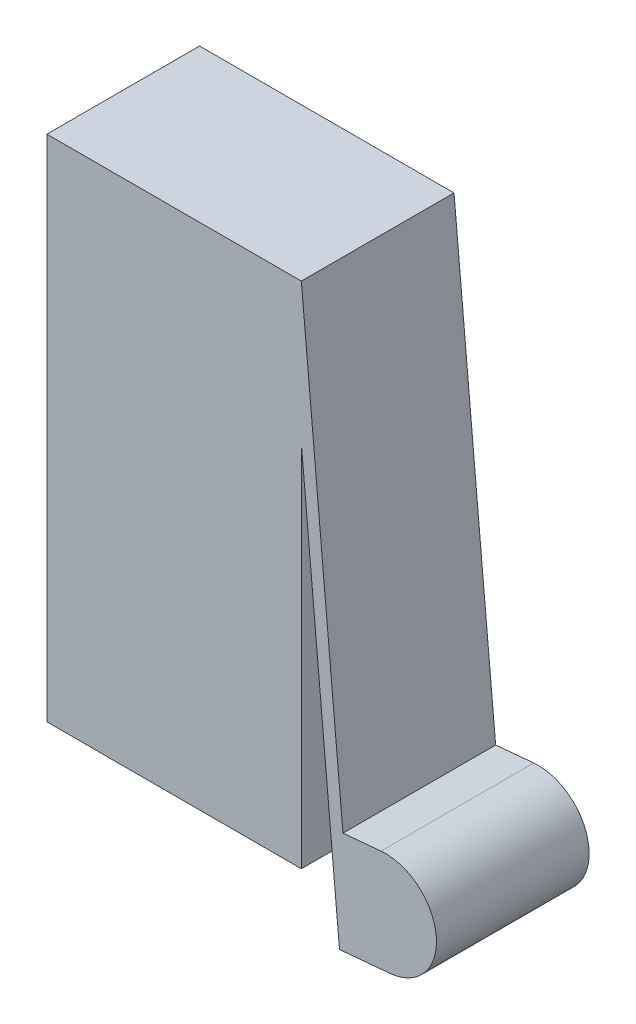
ISO-10303-21;
HEADER;
FILE_DESCRIPTION(('STEP AP214'),'2;1');
FILE_NAME('part.step','',(''),(''),'','','');
FILE_SCHEMA(('AUTOMOTIVE_DESIGN { 1 0 10303 214 1 1 1 1 }'));
ENDSEC;
DATA;
#1=APPLICATION_CONTEXT('core data for automotive mechanical design processes');
#2=APPLICATION_PROTOCOL_DEFINITION('international standard','automotive_design',2000,#1);
#3=PRODUCT_CONTEXT('',#1,'mechanical');
#4=PRODUCT('Part','Part','',(#3));
#5=PRODUCT_RELATED_PRODUCT_CATEGORY('part','',(#4));
#6=PRODUCT_DEFINITION_FORMATION('','',#4);
#7=PRODUCT_DEFINITION_CONTEXT('part definition',#1,'design');
#8=PRODUCT_DEFINITION('design','',#6,#7);
#9=PRODUCT_DEFINITION_SHAPE('','',#8);
#10=(LENGTH_UNIT() NAMED_UNIT(*) SI_UNIT(.MILLI.,.METRE.));
#11=(NAMED_UNIT(*) PLANE_ANGLE_UNIT() SI_UNIT($,.RADIAN.));
#12=(NAMED_UNIT(*) SI_UNIT($,.STERADIAN.) SOLID_ANGLE_UNIT());
#13=UNCERTAINTY_MEASURE_WITH_UNIT(LENGTH_MEASURE(1.E-05),#10,'distance_accuracy_value','');
#14=(GEOMETRIC_REPRESENTATION_CONTEXT(3) GLOBAL_UNCERTAINTY_ASSIGNED_CONTEXT((#13)) GLOBAL_UNIT_ASSIGNED_CONTEXT((#10,
#11,#12)) REPRESENTATION_CONTEXT('',''));
#15=CARTESIAN_POINT('',(0.,0.,0.));
#16=DIRECTION('',(0.,0.,1.));
#17=DIRECTION('',(1.,0.,0.));
#18=AXIS2_PLACEMENT_3D('',#15,#16,#17);
#19=CARTESIAN_POINT('',(10.,0.,6.));
#20=DIRECTION('',(1.,0.,0.));
#21=DIRECTION('',(0.,1.,0.));
#22=AXIS2_PLACEMENT_3D('',#19,#20,#21);
#23=PLANE('',#22);
#24=DIRECTION('',(0.,-1.,0.));
#25=VECTOR('',#24,1.);
#26=CARTESIAN_POINT('',(10.,0.,0.));
#27=LINE('',#26,#25);
#28=CARTESIAN_POINT('',(10.,14.4829721181068,0.));
#29=VERTEX_POINT('',#28);
#30=CARTESIAN_POINT('',(10.,0.,0.));
#31=VERTEX_POINT('',#30);
#32=EDGE_CURVE('E134',#29,#31,#27,.T.);
#33=ORIENTED_EDGE('',*,*,#32,.F.);
#34=DIRECTION('',(0.,0.,-1.));
#35=VECTOR('',#34,1.);
#36=CARTESIAN_POINT('',(10.,14.4829721181068,6.));
#37=LINE('',#36,#35);
#38=CARTESIAN_POINT('',(10.,14.4829721181068,6.));
#39=VERTEX_POINT('',#38);
#40=EDGE_CURVE('E11',#39,#29,#37,.T.);
#41=ORIENTED_EDGE('',*,*,#40,.F.);
#42=DIRECTION('',(0.,-1.,0.));
#43=VECTOR('',#42,1.);
#44=CARTESIAN_POINT('',(10.,0.,6.));
#45=LINE('',#44,#43);
#46=CARTESIAN_POINT('',(10.,0.,6.));
#47=VERTEX_POINT('',#46);
#48=EDGE_CURVE('E155',#39,#47,#45,.T.);
#49=ORIENTED_EDGE('',*,*,#48,.T.);
#50=DIRECTION('',(0.,0.,-1.));
#51=VECTOR('',#50,1.);
#52=CARTESIAN_POINT('',(10.,0.,6.));
#53=LINE('',#52,#51);
#54=EDGE_CURVE('E86',#47,#31,#53,.T.);
#55=ORIENTED_EDGE('',*,*,#54,.T.);
#56=EDGE_LOOP('',(#33,#41,#49,#55));
#57=FACE_BOUND('',#56,.T.);
#58=ADVANCED_FACE('F33',(#57),#23,.T.);
#59=CARTESIAN_POINT('',(11.2250333482068,1.02151176994432,6.));
#60=DIRECTION('',(0.995884769297829,0.0906285069975793,0.));
#61=DIRECTION('',(-0.0906285069975793,0.995884769297829,0.));
#62=AXIS2_PLACEMENT_3D('',#59,#60,#61);
#63=PLANE('',#62);
#64=DIRECTION('',(0.0906285069975793,-0.995884769297829,0.));
#65=VECTOR('',#64,1.);
#66=CARTESIAN_POINT('',(11.2250333482068,1.02151176994432,0.));
#67=LINE('',#66,#65);
#68=CARTESIAN_POINT('',(11.5,-2.,0.));
#69=VERTEX_POINT('',#68);
#70=EDGE_CURVE('E137',#29,#69,#67,.T.);
#71=ORIENTED_EDGE('',*,*,#70,.T.);
#72=DIRECTION('',(0.,0.,-1.));
#73=VECTOR('',#72,1.);
#74=CARTESIAN_POINT('',(11.5,-2.,6.));
#75=LINE('',#74,#73);
#76=CARTESIAN_POINT('',(11.5,-2.,6.));
#77=VERTEX_POINT('',#76);
#78=EDGE_CURVE('E41',#77,#69,#75,.T.);
#79=ORIENTED_EDGE('',*,*,#78,.F.);
#80=DIRECTION('',(0.0906285069975793,-0.995884769297829,0.));
#81=VECTOR('',#80,1.);
#82=CARTESIAN_POINT('',(11.2250333482068,1.02151176994432,6.));
#83=LINE('',#82,#81);
#84=EDGE_CURVE('E185',#39,#77,#83,.T.);
#85=ORIENTED_EDGE('',*,*,#84,.F.);
#86=ORIENTED_EDGE('',*,*,#40,.T.);
#87=EDGE_LOOP('',(#71,#79,#85,#86));
#88=FACE_BOUND('',#87,.T.);
#89=ADVANCED_FACE('F189',(#88),#63,.F.);
#90=CARTESIAN_POINT('',(0.274966651793202,-3.02151176994433,6.));
#91=DIRECTION('',(-0.0906285069975797,0.995884769297829,0.));
#92=DIRECTION('',(-0.995884769297829,-0.0906285069975797,0.));
#93=AXIS2_PLACEMENT_3D('',#90,#91,#92);
#94=PLANE('',#93);
#95=DIRECTION('',(0.995884769297829,0.0906285069975797,0.));
#96=VECTOR('',#95,1.);
#97=CARTESIAN_POINT('',(0.274966651793202,-3.02151176994433,0.));
#98=LINE('',#97,#96);
#99=CARTESIAN_POINT('',(13.4917695385957,-1.81874298600484,0.));
#100=VERTEX_POINT('',#99);
#101=EDGE_CURVE('E139',#69,#100,#98,.T.);
#102=ORIENTED_EDGE('',*,*,#101,.T.);
#103=DIRECTION('',(0.,0.,-1.));
#104=VECTOR('',#103,1.);
#105=CARTESIAN_POINT('',(13.4917695385957,-1.81874298600484,6.));
#106=LINE('',#105,#104);
#107=CARTESIAN_POINT('',(13.4917695385957,-1.81874298600484,6.));
#108=VERTEX_POINT('',#107);
#109=EDGE_CURVE('E163',#108,#100,#106,.T.);
#110=ORIENTED_EDGE('',*,*,#109,.F.);
#111=DIRECTION('',(0.995884769297829,0.0906285069975797,0.));
#112=VECTOR('',#111,1.);
#113=CARTESIAN_POINT('',(0.274966651793202,-3.02151176994433,6.));
#114=LINE('',#113,#112);
#115=EDGE_CURVE('E171',#77,#108,#114,.T.);
#116=ORIENTED_EDGE('',*,*,#115,.F.);
#117=ORIENTED_EDGE('',*,*,#78,.T.);
#118=EDGE_LOOP('',(#102,#110,#116,#117));
#119=FACE_BOUND('',#118,.T.);
#120=ADVANCED_FACE('F169',(#119),#94,.F.);
#121=CARTESIAN_POINT('',(13.3105125246005,0.173026552590817,6.));
#122=DIRECTION('',(0.,0.,-1.));
#123=DIRECTION('',(-1.,0.,0.));
#124=AXIS2_PLACEMENT_3D('',#121,#122,#123);
#125=CYLINDRICAL_SURFACE('',#124,2.);
#126=CARTESIAN_POINT('',(13.3105125246005,0.173026552590817,0.));
#127=DIRECTION('',(0.,0.,1.));
#128=DIRECTION('',(1.,0.,0.));
#129=AXIS2_PLACEMENT_3D('',#126,#127,#128);
#130=CIRCLE('',#129,2.);
#131=CARTESIAN_POINT('',(13.1292555106053,2.16479609118647,0.));
#132=VERTEX_POINT('',#131);
#133=EDGE_CURVE('E142',#132,#100,#130,.F.);
#134=ORIENTED_EDGE('',*,*,#133,.F.);
#135=DIRECTION('',(0.,0.,-1.));
#136=VECTOR('',#135,1.);
#137=CARTESIAN_POINT('',(13.1292555106053,2.16479609118647,6.));
#138=LINE('',#137,#136);
#139=CARTESIAN_POINT('',(13.1292555106053,2.16479609118647,6.));
#140=VERTEX_POINT('',#139);
#141=EDGE_CURVE('E161',#140,#132,#138,.T.);
#142=ORIENTED_EDGE('',*,*,#141,.F.);
#143=CARTESIAN_POINT('',(13.3105125246005,0.173026552590817,6.));
#144=DIRECTION('',(0.,0.,1.));
#145=DIRECTION('',(1.,0.,0.));
#146=AXIS2_PLACEMENT_3D('',#143,#144,#145);
#147=CIRCLE('',#146,2.);
#148=EDGE_CURVE('E182',#140,#108,#147,.F.);
#149=ORIENTED_EDGE('',*,*,#148,.T.);
#150=ORIENTED_EDGE('',*,*,#109,.T.);
#151=EDGE_LOOP('',(#134,#142,#149,#150));
#152=FACE_BOUND('',#151,.T.);
#153=ADVANCED_FACE('F179',(#152),#125,.T.);
#154=CARTESIAN_POINT('',(-0.0875473761971172,0.96202730724699,6.));
#155=DIRECTION('',(-0.0906285069975793,0.995884769297829,0.));
#156=DIRECTION('',(-0.995884769297829,-0.0906285069975793,0.));
#157=AXIS2_PLACEMENT_3D('',#154,#155,#156);
#158=PLANE('',#157);
#159=DIRECTION('',(0.995884769297829,0.0906285069975793,0.));
#160=VECTOR('',#159,1.);
#161=CARTESIAN_POINT('',(-0.0875473761971172,0.96202730724699,0.));
#162=LINE('',#161,#160);
#163=CARTESIAN_POINT('',(11.6354283566586,2.02885333069011,0.));
#164=VERTEX_POINT('',#163);
#165=EDGE_CURVE('E145',#164,#132,#162,.T.);
#166=ORIENTED_EDGE('',*,*,#165,.F.);
#167=DIRECTION('',(0.,0.,-1.));
#168=VECTOR('',#167,1.);
#169=CARTESIAN_POINT('',(11.6354283566586,2.02885333069011,6.));
#170=LINE('',#169,#168);
#171=CARTESIAN_POINT('',(11.6354283566586,2.02885333069011,6.));
#172=VERTEX_POINT('',#171);
#173=EDGE_CURVE('E159',#172,#164,#170,.T.);
#174=ORIENTED_EDGE('',*,*,#173,.F.);
#175=DIRECTION('',(0.995884769297829,0.0906285069975793,0.));
#176=VECTOR('',#175,1.);
#177=CARTESIAN_POINT('',(-0.0875473761971172,0.96202730724699,6.));
#178=LINE('',#177,#176);
#179=EDGE_CURVE('E129',#172,#140,#178,.T.);
#180=ORIENTED_EDGE('',*,*,#179,.T.);
#181=ORIENTED_EDGE('',*,*,#141,.T.);
#182=EDGE_LOOP('',(#166,#174,#180,#181));
#183=FACE_BOUND('',#182,.T.);
#184=ADVANCED_FACE('F199',(#183),#158,.T.);
#185=CARTESIAN_POINT('',(11.7229757328557,1.06682602344312,6.));
#186=DIRECTION('',(0.995884769297829,0.0906285069975793,0.));
#187=DIRECTION('',(-0.0906285069975793,0.995884769297829,0.));
#188=AXIS2_PLACEMENT_3D('',#185,#186,#187);
#189=PLANE('',#188);
#190=DIRECTION('',(0.0906285069975793,-0.995884769297829,0.));
#191=VECTOR('',#190,1.);
#192=CARTESIAN_POINT('',(11.7229757328557,1.06682602344312,0.));
#193=LINE('',#192,#191);
#194=CARTESIAN_POINT('',(10.,20.,0.));
#195=VERTEX_POINT('',#194);
#196=EDGE_CURVE('E148',#195,#164,#193,.T.);
#197=ORIENTED_EDGE('',*,*,#196,.F.);
#198=DIRECTION('',(0.,0.,-1.));
#199=VECTOR('',#198,1.);
#200=CARTESIAN_POINT('',(10.,20.,6.));
#201=LINE('',#200,#199);
#202=CARTESIAN_POINT('',(10.,20.,6.));
#203=VERTEX_POINT('',#202);
#204=EDGE_CURVE('E117',#203,#195,#201,.T.);
#205=ORIENTED_EDGE('',*,*,#204,.F.);
#206=DIRECTION('',(0.0906285069975793,-0.995884769297829,0.));
#207=VECTOR('',#206,1.);
#208=CARTESIAN_POINT('',(11.7229757328557,1.06682602344312,6.));
#209=LINE('',#208,#207);
#210=EDGE_CURVE('E127',#203,#172,#209,.T.);
#211=ORIENTED_EDGE('',*,*,#210,.T.);
#212=ORIENTED_EDGE('',*,*,#173,.T.);
#213=EDGE_LOOP('',(#197,#205,#211,#212));
#214=FACE_BOUND('',#213,.T.);
#215=ADVANCED_FACE('F202',(#214),#189,.T.);
#216=CARTESIAN_POINT('',(0.,20.,6.));
#217=DIRECTION('',(0.,1.,0.));
#218=DIRECTION('',(0.,0.,1.));
#219=AXIS2_PLACEMENT_3D('',#216,#217,#218);
#220=PLANE('',#219);
#221=DIRECTION('',(1.,0.,0.));
#222=VECTOR('',#221,1.);
#223=CARTESIAN_POINT('',(0.,20.,0.));
#224=LINE('',#223,#222);
#225=CARTESIAN_POINT('',(0.,20.,0.));
#226=VERTEX_POINT('',#225);
#227=EDGE_CURVE('E116',#226,#195,#224,.T.);
#228=ORIENTED_EDGE('',*,*,#227,.F.);
#229=DIRECTION('',(0.,0.,-1.));
#230=VECTOR('',#229,1.);
#231=CARTESIAN_POINT('',(0.,20.,6.));
#232=LINE('',#231,#230);
#233=CARTESIAN_POINT('',(0.,20.,6.));
#234=VERTEX_POINT('',#233);
#235=EDGE_CURVE('E110',#234,#226,#232,.T.);
#236=ORIENTED_EDGE('',*,*,#235,.F.);
#237=DIRECTION('',(1.,0.,0.));
#238=VECTOR('',#237,1.);
#239=CARTESIAN_POINT('',(0.,20.,6.));
#240=LINE('',#239,#238);
#241=EDGE_CURVE('E114',#234,#203,#240,.T.);
#242=ORIENTED_EDGE('',*,*,#241,.T.);
#243=ORIENTED_EDGE('',*,*,#204,.T.);
#244=EDGE_LOOP('',(#228,#236,#242,#243));
#245=FACE_BOUND('',#244,.T.);
#246=ADVANCED_FACE('F112',(#245),#220,.T.);
#247=CARTESIAN_POINT('',(0.,0.,6.));
#248=DIRECTION('',(1.,0.,0.));
#249=DIRECTION('',(0.,1.,0.));
#250=AXIS2_PLACEMENT_3D('',#247,#248,#249);
#251=PLANE('',#250);
#252=DIRECTION('',(0.,-1.,0.));
#253=VECTOR('',#252,1.);
#254=CARTESIAN_POINT('',(0.,0.,0.));
#255=LINE('',#254,#253);
#256=CARTESIAN_POINT('',(0.,0.,0.));
#257=VERTEX_POINT('',#256);
#258=EDGE_CURVE('E79',#226,#257,#255,.T.);
#259=ORIENTED_EDGE('',*,*,#258,.T.);
#260=DIRECTION('',(0.,0.,-1.));
#261=VECTOR('',#260,1.);
#262=CARTESIAN_POINT('',(0.,0.,6.));
#263=LINE('',#262,#261);
#264=CARTESIAN_POINT('',(0.,0.,6.));
#265=VERTEX_POINT('',#264);
#266=EDGE_CURVE('E118',#265,#257,#263,.T.);
#267=ORIENTED_EDGE('',*,*,#266,.F.);
#268=DIRECTION('',(0.,-1.,0.));
#269=VECTOR('',#268,1.);
#270=CARTESIAN_POINT('',(0.,0.,6.));
#271=LINE('',#270,#269);
#272=EDGE_CURVE('E120',#234,#265,#271,.T.);
#273=ORIENTED_EDGE('',*,*,#272,.F.);
#274=ORIENTED_EDGE('',*,*,#235,.T.);
#275=EDGE_LOOP('',(#259,#267,#273,#274));
#276=FACE_BOUND('',#275,.T.);
#277=ADVANCED_FACE('F121',(#276),#251,.F.);
#278=CARTESIAN_POINT('',(0.,0.,6.));
#279=DIRECTION('',(0.,1.,0.));
#280=DIRECTION('',(0.,0.,1.));
#281=AXIS2_PLACEMENT_3D('',#278,#279,#280);
#282=PLANE('',#281);
#283=DIRECTION('',(1.,0.,0.));
#284=VECTOR('',#283,1.);
#285=CARTESIAN_POINT('',(0.,0.,0.));
#286=LINE('',#285,#284);
#287=EDGE_CURVE('E153',#257,#31,#286,.T.);
#288=ORIENTED_EDGE('',*,*,#287,.T.);
#289=ORIENTED_EDGE('',*,*,#54,.F.);
#290=DIRECTION('',(1.,0.,0.));
#291=VECTOR('',#290,1.);
#292=CARTESIAN_POINT('',(0.,0.,6.));
#293=LINE('',#292,#291);
#294=EDGE_CURVE('E49',#265,#47,#293,.T.);
#295=ORIENTED_EDGE('',*,*,#294,.F.);
#296=ORIENTED_EDGE('',*,*,#266,.T.);
#297=EDGE_LOOP('',(#288,#289,#295,#296));
#298=FACE_BOUND('',#297,.T.);
#299=ADVANCED_FACE('F211',(#298),#282,.F.);
#300=CARTESIAN_POINT('',(0.,0.,6.));
#301=DIRECTION('',(0.,0.,1.));
#302=DIRECTION('',(1.,0.,0.));
#303=AXIS2_PLACEMENT_3D('',#300,#301,#302);
#304=PLANE('',#303);
#305=ORIENTED_EDGE('',*,*,#48,.F.);
#306=ORIENTED_EDGE('',*,*,#84,.T.);
#307=ORIENTED_EDGE('',*,*,#115,.T.);
#308=ORIENTED_EDGE('',*,*,#148,.F.);
#309=ORIENTED_EDGE('',*,*,#179,.F.);
#310=ORIENTED_EDGE('',*,*,#210,.F.);
#311=ORIENTED_EDGE('',*,*,#241,.F.);
#312=ORIENTED_EDGE('',*,*,#272,.T.);
#313=ORIENTED_EDGE('',*,*,#294,.T.);
#314=EDGE_LOOP('',(#305,#306,#307,#308,#309,#310,#311,#312,#313));
#315=FACE_BOUND('',#314,.T.);
#316=ADVANCED_FACE('F124',(#315),#304,.T.);
#317=CARTESIAN_POINT('',(0.,0.,0.));
#318=DIRECTION('',(0.,0.,1.));
#319=DIRECTION('',(1.,0.,0.));
#320=AXIS2_PLACEMENT_3D('',#317,#318,#319);
#321=PLANE('',#320);
#322=ORIENTED_EDGE('',*,*,#32,.T.);
#323=ORIENTED_EDGE('',*,*,#287,.F.);
#324=ORIENTED_EDGE('',*,*,#258,.F.);
#325=ORIENTED_EDGE('',*,*,#227,.T.);
#326=ORIENTED_EDGE('',*,*,#196,.T.);
#327=ORIENTED_EDGE('',*,*,#165,.T.);
#328=ORIENTED_EDGE('',*,*,#133,.T.);
#329=ORIENTED_EDGE('',*,*,#101,.F.);
#330=ORIENTED_EDGE('',*,*,#70,.F.);
#331=EDGE_LOOP('',(#322,#323,#324,#325,#326,#327,#328,#329,#330));
#332=FACE_BOUND('',#331,.T.);
#333=ADVANCED_FACE('F175',(#332),#321,.F.);
#334=CLOSED_SHELL('',(#58,#89,#120,#153,#184,#215,#246,#277,#299,#316,#333));
#335=MANIFOLD_SOLID_BREP('B2',#334);
#336=ADVANCED_BREP_SHAPE_REPRESENTATION('',(#18,#335),#14);
#337=SHAPE_DEFINITION_REPRESENTATION(#9,#336);
ENDSEC;
END-ISO-10303-21;
